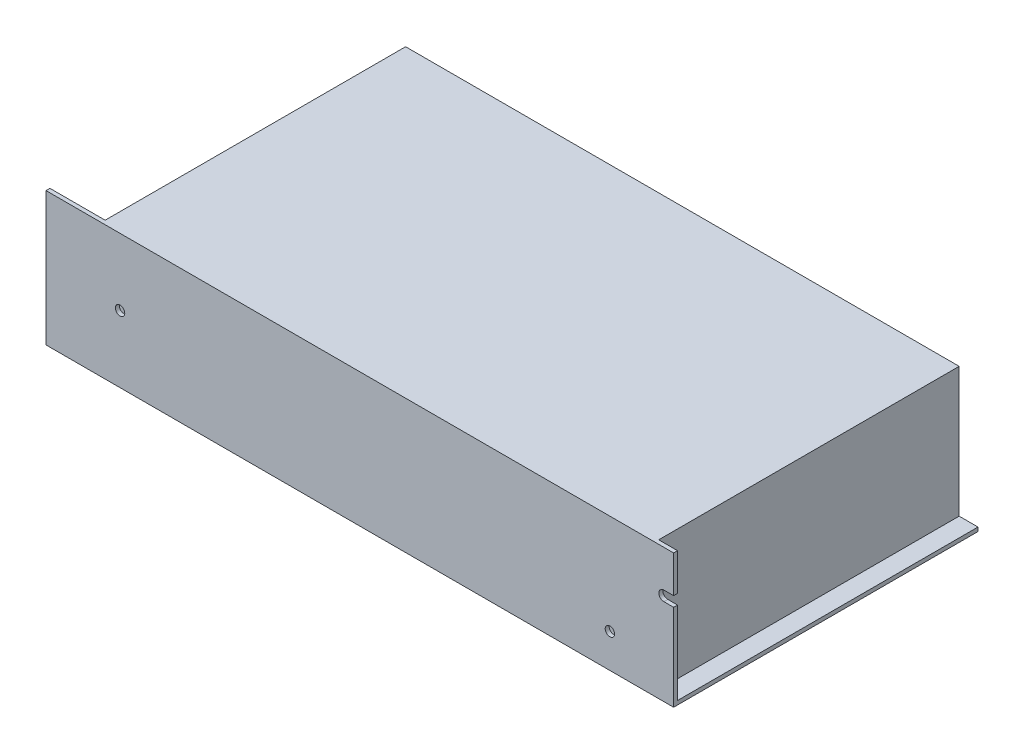
ISO-10303-21;
HEADER;
FILE_DESCRIPTION(('STEP AP214'),'2;1');
FILE_NAME('part.step','',(''),(''),'','','');
FILE_SCHEMA(('AUTOMOTIVE_DESIGN { 1 0 10303 214 1 1 1 1 }'));
ENDSEC;
DATA;
#1=APPLICATION_CONTEXT('core data for automotive mechanical design processes');
#2=APPLICATION_PROTOCOL_DEFINITION('international standard','automotive_design',2000,#1);
#3=PRODUCT_CONTEXT('',#1,'mechanical');
#4=PRODUCT('Part','Part','',(#3));
#5=PRODUCT_RELATED_PRODUCT_CATEGORY('part','',(#4));
#6=PRODUCT_DEFINITION_FORMATION('','',#4);
#7=PRODUCT_DEFINITION_CONTEXT('part definition',#1,'design');
#8=PRODUCT_DEFINITION('design','',#6,#7);
#9=PRODUCT_DEFINITION_SHAPE('','',#8);
#10=(LENGTH_UNIT() NAMED_UNIT(*) SI_UNIT(.MILLI.,.METRE.));
#11=(NAMED_UNIT(*) PLANE_ANGLE_UNIT() SI_UNIT($,.RADIAN.));
#12=(NAMED_UNIT(*) SI_UNIT($,.STERADIAN.) SOLID_ANGLE_UNIT());
#13=UNCERTAINTY_MEASURE_WITH_UNIT(LENGTH_MEASURE(1.E-05),#10,'distance_accuracy_value','');
#14=(GEOMETRIC_REPRESENTATION_CONTEXT(3) GLOBAL_UNCERTAINTY_ASSIGNED_CONTEXT((#13)) GLOBAL_UNIT_ASSIGNED_CONTEXT((#10,
#11,#12)) REPRESENTATION_CONTEXT('',''));
#15=CARTESIAN_POINT('',(0.,0.,0.));
#16=DIRECTION('',(0.,0.,1.));
#17=DIRECTION('',(1.,0.,0.));
#18=AXIS2_PLACEMENT_3D('',#15,#16,#17);
#19=CARTESIAN_POINT('',(139.453125,1.25,-54.8828125));
#20=DIRECTION('',(-1.,0.,0.));
#21=DIRECTION('',(0.,0.,1.));
#22=AXIS2_PLACEMENT_3D('',#19,#20,#21);
#23=PLANE('',#22);
#24=DIRECTION('',(0.,-1.,0.));
#25=VECTOR('',#24,1.);
#26=CARTESIAN_POINT('',(139.453125,1.25,-54.8828125));
#27=LINE('',#26,#25);
#28=CARTESIAN_POINT('',(139.453125,1.25,-54.8828125));
#29=VERTEX_POINT('',#28);
#30=CARTESIAN_POINT('',(139.453125,0.,-54.8828125));
#31=VERTEX_POINT('',#30);
#32=EDGE_CURVE('E292',#29,#31,#27,.T.);
#33=ORIENTED_EDGE('',*,*,#32,.F.);
#34=DIRECTION('',(0.,0.,-1.));
#35=VECTOR('',#34,1.);
#36=CARTESIAN_POINT('',(139.453125,1.25,40.8671875));
#37=LINE('',#36,#35);
#38=CARTESIAN_POINT('',(139.453125,1.25,40.8671875));
#39=VERTEX_POINT('',#38);
#40=EDGE_CURVE('E165',#39,#29,#37,.T.);
#41=ORIENTED_EDGE('',*,*,#40,.F.);
#42=DIRECTION('',(0.,-1.,0.));
#43=VECTOR('',#42,1.);
#44=CARTESIAN_POINT('',(139.453125,1.25,40.8671875));
#45=LINE('',#44,#43);
#46=CARTESIAN_POINT('',(139.453125,27.6,40.8671875));
#47=VERTEX_POINT('',#46);
#48=EDGE_CURVE('E331',#47,#39,#45,.T.);
#49=ORIENTED_EDGE('',*,*,#48,.F.);
#50=DIRECTION('',(0.,0.,1.));
#51=VECTOR('',#50,1.);
#52=CARTESIAN_POINT('',(139.453125,27.6,35.1812399096682));
#53=LINE('',#52,#51);
#54=CARTESIAN_POINT('',(139.453125,27.6,42.1171875));
#55=VERTEX_POINT('',#54);
#56=EDGE_CURVE('E188',#47,#55,#53,.T.);
#57=ORIENTED_EDGE('',*,*,#56,.T.);
#58=DIRECTION('',(0.,-1.,0.));
#59=VECTOR('',#58,1.);
#60=CARTESIAN_POINT('',(139.453125,1.25,42.1171875));
#61=LINE('',#60,#59);
#62=CARTESIAN_POINT('',(139.453125,0.,42.1171875));
#63=VERTEX_POINT('',#62);
#64=EDGE_CURVE('E293',#55,#63,#61,.T.);
#65=ORIENTED_EDGE('',*,*,#64,.T.);
#66=DIRECTION('',(0.,0.,-1.));
#67=VECTOR('',#66,1.);
#68=CARTESIAN_POINT('',(139.453125,0.,-54.8828125));
#69=LINE('',#68,#67);
#70=EDGE_CURVE('E286',#63,#31,#69,.T.);
#71=ORIENTED_EDGE('',*,*,#70,.T.);
#72=EDGE_LOOP('',(#33,#41,#49,#57,#65,#71));
#73=FACE_BOUND('',#72,.T.);
#74=ADVANCED_FACE('F32',(#73),#23,.F.);
#75=CARTESIAN_POINT('',(0.,1.25,0.));
#76=DIRECTION('',(0.,1.,0.));
#77=DIRECTION('',(0.,0.,1.));
#78=AXIS2_PLACEMENT_3D('',#75,#76,#77);
#79=PLANE('',#78);
#80=DIRECTION('',(0.,0.,1.));
#81=VECTOR('',#80,1.);
#82=CARTESIAN_POINT('',(-42.9514329885592,1.25,-54.8828125));
#83=LINE('',#82,#81);
#84=CARTESIAN_POINT('',(-42.9514329885592,1.25,34.015615746176));
#85=VERTEX_POINT('',#84);
#86=CARTESIAN_POINT('',(-42.9514329885592,1.25,40.8671875));
#87=VERTEX_POINT('',#86);
#88=EDGE_CURVE('E54',#85,#87,#83,.T.);
#89=ORIENTED_EDGE('',*,*,#88,.F.);
#90=DIRECTION('',(1.,0.,0.));
#91=VECTOR('',#90,1.);
#92=CARTESIAN_POINT('',(-60.546875,1.25,34.015615746176));
#93=LINE('',#92,#91);
#94=CARTESIAN_POINT('',(-60.546875,1.25,34.015615746176));
#95=VERTEX_POINT('',#94);
#96=EDGE_CURVE('E201',#95,#85,#93,.T.);
#97=ORIENTED_EDGE('',*,*,#96,.F.);
#98=DIRECTION('',(0.,0.,1.));
#99=VECTOR('',#98,1.);
#100=CARTESIAN_POINT('',(-60.546875,1.25,-54.8828125));
#101=LINE('',#100,#99);
#102=CARTESIAN_POINT('',(-60.546875,1.25,40.8671875));
#103=VERTEX_POINT('',#102);
#104=EDGE_CURVE('E278',#95,#103,#101,.T.);
#105=ORIENTED_EDGE('',*,*,#104,.T.);
#106=DIRECTION('',(-1.,0.,0.));
#107=VECTOR('',#106,1.);
#108=CARTESIAN_POINT('',(0.,1.25,40.8671875));
#109=LINE('',#108,#107);
#110=EDGE_CURVE('E274',#87,#103,#109,.T.);
#111=ORIENTED_EDGE('',*,*,#110,.F.);
#112=EDGE_LOOP('',(#89,#97,#105,#111));
#113=FACE_BOUND('',#112,.T.);
#114=ADVANCED_FACE('F347',(#113),#79,.T.);
#115=CARTESIAN_POINT('',(-42.9514329885592,248.608459231658,-54.8828125));
#116=DIRECTION('',(1.,0.,0.));
#117=DIRECTION('',(0.,0.,-1.));
#118=AXIS2_PLACEMENT_3D('',#115,#116,#117);
#119=PLANE('',#118);
#120=DIRECTION('',(0.,-1.,0.));
#121=VECTOR('',#120,1.);
#122=CARTESIAN_POINT('',(-42.9514329885592,23.25,34.015615746176));
#123=LINE('',#122,#121);
#124=CARTESIAN_POINT('',(-42.9514329885592,23.25,34.015615746176));
#125=VERTEX_POINT('',#124);
#126=EDGE_CURVE('E47',#125,#85,#123,.T.);
#127=ORIENTED_EDGE('',*,*,#126,.T.);
#128=ORIENTED_EDGE('',*,*,#88,.T.);
#129=DIRECTION('',(0.,-1.,0.));
#130=VECTOR('',#129,1.);
#131=CARTESIAN_POINT('',(-42.9514329885592,248.608459231658,40.8671875));
#132=LINE('',#131,#130);
#133=CARTESIAN_POINT('',(-42.9514329885592,42.6,40.8671875));
#134=VERTEX_POINT('',#133);
#135=EDGE_CURVE('E236',#134,#87,#132,.T.);
#136=ORIENTED_EDGE('',*,*,#135,.F.);
#137=DIRECTION('',(0.,0.,-1.));
#138=VECTOR('',#137,1.);
#139=CARTESIAN_POINT('',(-42.9514329885592,42.6,-54.8828125));
#140=LINE('',#139,#138);
#141=CARTESIAN_POINT('',(-42.9514329885592,42.6,-54.8828125));
#142=VERTEX_POINT('',#141);
#143=EDGE_CURVE('E227',#134,#142,#140,.T.);
#144=ORIENTED_EDGE('',*,*,#143,.T.);
#145=DIRECTION('',(0.,-1.,0.));
#146=VECTOR('',#145,1.);
#147=CARTESIAN_POINT('',(-42.9514329885592,248.608459231658,-54.8828125));
#148=LINE('',#147,#146);
#149=CARTESIAN_POINT('',(-42.9514329885592,23.25,-54.8828125));
#150=VERTEX_POINT('',#149);
#151=EDGE_CURVE('E233',#142,#150,#148,.T.);
#152=ORIENTED_EDGE('',*,*,#151,.T.);
#153=DIRECTION('',(0.,0.,-1.));
#154=VECTOR('',#153,1.);
#155=CARTESIAN_POINT('',(-42.9514329885592,23.25,-54.8828125));
#156=LINE('',#155,#154);
#157=EDGE_CURVE('E218',#125,#150,#156,.T.);
#158=ORIENTED_EDGE('',*,*,#157,.F.);
#159=EDGE_LOOP('',(#127,#128,#136,#144,#152,#158));
#160=FACE_BOUND('',#159,.T.);
#161=ADVANCED_FACE('F325',(#160),#119,.F.);
#162=CARTESIAN_POINT('',(-60.546875,42.6,40.8671875));
#163=DIRECTION('',(0.,0.,-1.));
#164=DIRECTION('',(-1.,0.,0.));
#165=AXIS2_PLACEMENT_3D('',#162,#163,#164);
#166=PLANE('',#165);
#167=DIRECTION('',(1.,0.,0.));
#168=VECTOR('',#167,1.);
#169=CARTESIAN_POINT('',(-60.546875,42.6,40.8671875));
#170=LINE('',#169,#168);
#171=CARTESIAN_POINT('',(-60.546875,42.6,40.8671875));
#172=VERTEX_POINT('',#171);
#173=EDGE_CURVE('E265',#172,#134,#170,.T.);
#174=ORIENTED_EDGE('',*,*,#173,.T.);
#175=ORIENTED_EDGE('',*,*,#135,.T.);
#176=ORIENTED_EDGE('',*,*,#110,.T.);
#177=DIRECTION('',(0.,-1.,0.));
#178=VECTOR('',#177,1.);
#179=CARTESIAN_POINT('',(-60.546875,42.6,40.8671875));
#180=LINE('',#179,#178);
#181=EDGE_CURVE('E271',#172,#103,#180,.T.);
#182=ORIENTED_EDGE('',*,*,#181,.F.);
#183=EDGE_LOOP('',(#174,#175,#176,#182));
#184=FACE_BOUND('',#183,.T.);
#185=ADVANCED_FACE('F410',(#184),#166,.T.);
#186=CARTESIAN_POINT('',(-60.546875,1.25,-54.8828125));
#187=DIRECTION('',(1.,0.,0.));
#188=DIRECTION('',(0.,0.,-1.));
#189=AXIS2_PLACEMENT_3D('',#186,#187,#188);
#190=PLANE('',#189);
#191=DIRECTION('',(0.,0.,1.));
#192=VECTOR('',#191,1.);
#193=CARTESIAN_POINT('',(-60.546875,0.,-54.8828125));
#194=LINE('',#193,#192);
#195=CARTESIAN_POINT('',(-60.546875,0.,-54.8828125));
#196=VERTEX_POINT('',#195);
#197=CARTESIAN_POINT('',(-60.546875,0.,42.1171875));
#198=VERTEX_POINT('',#197);
#199=EDGE_CURVE('E277',#196,#198,#194,.T.);
#200=ORIENTED_EDGE('',*,*,#199,.T.);
#201=DIRECTION('',(0.,-1.,0.));
#202=VECTOR('',#201,1.);
#203=CARTESIAN_POINT('',(-60.546875,1.25,42.1171875));
#204=LINE('',#203,#202);
#205=CARTESIAN_POINT('',(-60.546875,42.6,42.1171875));
#206=VERTEX_POINT('',#205);
#207=EDGE_CURVE('E11',#206,#198,#204,.T.);
#208=ORIENTED_EDGE('',*,*,#207,.F.);
#209=DIRECTION('',(0.,0.,-1.));
#210=VECTOR('',#209,1.);
#211=CARTESIAN_POINT('',(-60.546875,42.6,42.1171875));
#212=LINE('',#211,#210);
#213=EDGE_CURVE('E262',#206,#172,#212,.T.);
#214=ORIENTED_EDGE('',*,*,#213,.T.);
#215=ORIENTED_EDGE('',*,*,#181,.T.);
#216=ORIENTED_EDGE('',*,*,#104,.F.);
#217=DIRECTION('',(0.,-1.,0.));
#218=VECTOR('',#217,1.);
#219=CARTESIAN_POINT('',(-60.546875,23.25,34.015615746176));
#220=LINE('',#219,#218);
#221=CARTESIAN_POINT('',(-60.546875,23.25,34.015615746176));
#222=VERTEX_POINT('',#221);
#223=EDGE_CURVE('E225',#222,#95,#220,.T.);
#224=ORIENTED_EDGE('',*,*,#223,.F.);
#225=DIRECTION('',(0.,0.,1.));
#226=VECTOR('',#225,1.);
#227=CARTESIAN_POINT('',(-60.546875,23.25,-54.8828125));
#228=LINE('',#227,#226);
#229=CARTESIAN_POINT('',(-60.546875,23.25,-54.8828125));
#230=VERTEX_POINT('',#229);
#231=EDGE_CURVE('E213',#230,#222,#228,.T.);
#232=ORIENTED_EDGE('',*,*,#231,.F.);
#233=DIRECTION('',(0.,-1.,0.));
#234=VECTOR('',#233,1.);
#235=CARTESIAN_POINT('',(-60.546875,1.25,-54.8828125));
#236=LINE('',#235,#234);
#237=EDGE_CURVE('E280',#230,#196,#236,.T.);
#238=ORIENTED_EDGE('',*,*,#237,.T.);
#239=EDGE_LOOP('',(#200,#208,#214,#215,#216,#224,#232,#238));
#240=FACE_BOUND('',#239,.T.);
#241=ADVANCED_FACE('F34',(#240),#190,.F.);
#242=CARTESIAN_POINT('',(-60.546875,1.25,42.1171875));
#243=DIRECTION('',(0.,0.,-1.));
#244=DIRECTION('',(-1.,0.,0.));
#245=AXIS2_PLACEMENT_3D('',#242,#243,#244);
#246=PLANE('',#245);
#247=ORIENTED_EDGE('',*,*,#64,.F.);
#248=DIRECTION('',(1.,0.,0.));
#249=VECTOR('',#248,1.);
#250=CARTESIAN_POINT('',(139.453125,27.6,42.1171875));
#251=LINE('',#250,#249);
#252=CARTESIAN_POINT('',(136.353125,27.6,42.1171875));
#253=VERTEX_POINT('',#252);
#254=EDGE_CURVE('E181',#253,#55,#251,.T.);
#255=ORIENTED_EDGE('',*,*,#254,.F.);
#256=CARTESIAN_POINT('',(136.353125,29.2,42.1171875));
#257=DIRECTION('',(0.,0.,1.));
#258=DIRECTION('',(1.,0.,0.));
#259=AXIS2_PLACEMENT_3D('',#256,#257,#258);
#260=CIRCLE('',#259,1.6);
#261=CARTESIAN_POINT('',(136.353125,30.8,42.1171875));
#262=VERTEX_POINT('',#261);
#263=EDGE_CURVE('E183',#262,#253,#260,.T.);
#264=ORIENTED_EDGE('',*,*,#263,.F.);
#265=DIRECTION('',(-1.,0.,0.));
#266=VECTOR('',#265,1.);
#267=CARTESIAN_POINT('',(136.353125,30.8,42.1171875));
#268=LINE('',#267,#266);
#269=CARTESIAN_POINT('',(139.453125,30.8,42.1171875));
#270=VERTEX_POINT('',#269);
#271=EDGE_CURVE('E177',#270,#262,#268,.T.);
#272=ORIENTED_EDGE('',*,*,#271,.F.);
#273=CARTESIAN_POINT('',(139.453125,42.6,42.1171875));
#274=VERTEX_POINT('',#273);
#275=EDGE_CURVE('E40',#274,#270,#61,.T.);
#276=ORIENTED_EDGE('',*,*,#275,.F.);
#277=DIRECTION('',(-1.,0.,0.));
#278=VECTOR('',#277,1.);
#279=CARTESIAN_POINT('',(-60.546875,42.6,42.1171875));
#280=LINE('',#279,#278);
#281=EDGE_CURVE('E268',#274,#206,#280,.T.);
#282=ORIENTED_EDGE('',*,*,#281,.T.);
#283=ORIENTED_EDGE('',*,*,#207,.T.);
#284=DIRECTION('',(1.,0.,0.));
#285=VECTOR('',#284,1.);
#286=CARTESIAN_POINT('',(-60.546875,0.,42.1171875));
#287=LINE('',#286,#285);
#288=EDGE_CURVE('E283',#198,#63,#287,.T.);
#289=ORIENTED_EDGE('',*,*,#288,.T.);
#290=EDGE_LOOP('',(#247,#255,#264,#272,#276,#282,#283,#289));
#291=FACE_BOUND('',#290,.T.);
#292=CARTESIAN_POINT('',(119.153125,10.8,42.1171875));
#293=DIRECTION('',(0.,0.,1.));
#294=DIRECTION('',(1.,0.,0.));
#295=AXIS2_PLACEMENT_3D('',#292,#293,#294);
#296=CIRCLE('',#295,1.5);
#297=CARTESIAN_POINT('',(120.653125,10.8,42.1171875));
#298=VERTEX_POINT('',#297);
#299=EDGE_CURVE('E202',#298,#298,#296,.T.);
#300=ORIENTED_EDGE('',*,*,#299,.F.);
#301=EDGE_LOOP('',(#300));
#302=FACE_BOUND('',#301,.T.);
#303=CARTESIAN_POINT('',(-36.946875,21.3,42.1171875));
#304=DIRECTION('',(0.,0.,1.));
#305=DIRECTION('',(1.,0.,0.));
#306=AXIS2_PLACEMENT_3D('',#303,#304,#305);
#307=CIRCLE('',#306,1.5);
#308=CARTESIAN_POINT('',(-35.446875,21.3,42.1171875));
#309=VERTEX_POINT('',#308);
#310=EDGE_CURVE('E208',#309,#309,#307,.T.);
#311=ORIENTED_EDGE('',*,*,#310,.F.);
#312=EDGE_LOOP('',(#311));
#313=FACE_BOUND('',#312,.T.);
#314=ADVANCED_FACE('F308',(#291,#302,#313),#246,.F.);
#315=DIRECTION('',(0.,0.,1.));
#316=VECTOR('',#315,1.);
#317=CARTESIAN_POINT('',(139.453125,30.8,35.1812399096682));
#318=LINE('',#317,#316);
#319=CARTESIAN_POINT('',(139.453125,30.8,40.8671875));
#320=VERTEX_POINT('',#319);
#321=EDGE_CURVE('E195',#320,#270,#318,.T.);
#322=ORIENTED_EDGE('',*,*,#321,.F.);
#323=CARTESIAN_POINT('',(139.453125,42.6,40.8671875));
#324=VERTEX_POINT('',#323);
#325=EDGE_CURVE('E332',#324,#320,#45,.T.);
#326=ORIENTED_EDGE('',*,*,#325,.F.);
#327=DIRECTION('',(0.,0.,1.));
#328=VECTOR('',#327,1.);
#329=CARTESIAN_POINT('',(139.453125,42.6,42.1171875));
#330=LINE('',#329,#328);
#331=EDGE_CURVE('E170',#324,#274,#330,.T.);
#332=ORIENTED_EDGE('',*,*,#331,.T.);
#333=ORIENTED_EDGE('',*,*,#275,.T.);
#334=EDGE_LOOP('',(#322,#326,#332,#333));
#335=FACE_BOUND('',#334,.T.);
#336=ADVANCED_FACE('F349',(#335),#23,.F.);
#337=CARTESIAN_POINT('',(-60.546875,1.25,-54.8828125));
#338=DIRECTION('',(0.,0.,1.));
#339=DIRECTION('',(1.,0.,0.));
#340=AXIS2_PLACEMENT_3D('',#337,#338,#339);
#341=PLANE('',#340);
#342=DIRECTION('',(0.,1.,0.));
#343=VECTOR('',#342,1.);
#344=CARTESIAN_POINT('',(133.453125,1.25,-54.8828125));
#345=LINE('',#344,#343);
#346=CARTESIAN_POINT('',(133.453125,1.25,-54.8828125));
#347=VERTEX_POINT('',#346);
#348=CARTESIAN_POINT('',(133.453125,42.6,-54.8828125));
#349=VERTEX_POINT('',#348);
#350=EDGE_CURVE('E162',#347,#349,#345,.T.);
#351=ORIENTED_EDGE('',*,*,#350,.F.);
#352=DIRECTION('',(1.,0.,0.));
#353=VECTOR('',#352,1.);
#354=CARTESIAN_POINT('',(133.453125,1.25,-54.8828125));
#355=LINE('',#354,#353);
#356=EDGE_CURVE('E172',#347,#29,#355,.T.);
#357=ORIENTED_EDGE('',*,*,#356,.T.);
#358=ORIENTED_EDGE('',*,*,#32,.T.);
#359=DIRECTION('',(-1.,0.,0.));
#360=VECTOR('',#359,1.);
#361=CARTESIAN_POINT('',(-60.546875,0.,-54.8828125));
#362=LINE('',#361,#360);
#363=EDGE_CURVE('E281',#31,#196,#362,.T.);
#364=ORIENTED_EDGE('',*,*,#363,.T.);
#365=ORIENTED_EDGE('',*,*,#237,.F.);
#366=DIRECTION('',(-1.,0.,0.));
#367=VECTOR('',#366,1.);
#368=CARTESIAN_POINT('',(-60.546875,23.25,-54.8828125));
#369=LINE('',#368,#367);
#370=EDGE_CURVE('E220',#150,#230,#369,.T.);
#371=ORIENTED_EDGE('',*,*,#370,.F.);
#372=ORIENTED_EDGE('',*,*,#151,.F.);
#373=DIRECTION('',(1.,0.,0.));
#374=VECTOR('',#373,1.);
#375=CARTESIAN_POINT('',(-42.9514329885592,42.6,-54.8828125));
#376=LINE('',#375,#374);
#377=EDGE_CURVE('E231',#142,#349,#376,.T.);
#378=ORIENTED_EDGE('',*,*,#377,.T.);
#379=EDGE_LOOP('',(#351,#357,#358,#364,#365,#371,#372,#378));
#380=FACE_BOUND('',#379,.T.);
#381=ADVANCED_FACE('F314',(#380),#341,.F.);
#382=CARTESIAN_POINT('',(0.,0.,0.));
#383=DIRECTION('',(0.,1.,0.));
#384=DIRECTION('',(0.,0.,1.));
#385=AXIS2_PLACEMENT_3D('',#382,#383,#384);
#386=PLANE('',#385);
#387=CARTESIAN_POINT('',(121.653125,0.,25.8671875));
#388=DIRECTION('',(0.,-1.,0.));
#389=DIRECTION('',(0.,0.,-1.));
#390=AXIS2_PLACEMENT_3D('',#387,#388,#389);
#391=CIRCLE('',#390,1.49999999999998);
#392=CARTESIAN_POINT('',(121.653125,0.,24.3671875));
#393=VERTEX_POINT('',#392);
#394=EDGE_CURVE('E245',#393,#393,#391,.T.);
#395=ORIENTED_EDGE('',*,*,#394,.F.);
#396=EDGE_LOOP('',(#395));
#397=FACE_BOUND('',#396,.T.);
#398=CARTESIAN_POINT('',(17.1068892776804,0.,-38.6328125000004));
#399=DIRECTION('',(0.,-1.,0.));
#400=DIRECTION('',(0.,0.,-1.));
#401=AXIS2_PLACEMENT_3D('',#398,#399,#400);
#402=CIRCLE('',#401,1.74623572231967);
#403=CARTESIAN_POINT('',(17.1068892776804,0.,-40.3790482223201));
#404=VERTEX_POINT('',#403);
#405=EDGE_CURVE('E244',#404,#404,#402,.T.);
#406=ORIENTED_EDGE('',*,*,#405,.F.);
#407=EDGE_LOOP('',(#406));
#408=FACE_BOUND('',#407,.T.);
#409=CARTESIAN_POINT('',(17.3531250000001,0.,25.8671875));
#410=DIRECTION('',(0.,-1.,0.));
#411=DIRECTION('',(0.,0.,-1.));
#412=AXIS2_PLACEMENT_3D('',#409,#410,#411);
#413=CIRCLE('',#412,1.49999999999998);
#414=CARTESIAN_POINT('',(17.3531250000001,0.,24.3671875));
#415=VERTEX_POINT('',#414);
#416=EDGE_CURVE('E230',#415,#415,#413,.T.);
#417=ORIENTED_EDGE('',*,*,#416,.F.);
#418=EDGE_LOOP('',(#417));
#419=FACE_BOUND('',#418,.T.);
#420=CARTESIAN_POINT('',(121.653125,0.,-38.6328125));
#421=DIRECTION('',(0.,-1.,0.));
#422=DIRECTION('',(0.,0.,-1.));
#423=AXIS2_PLACEMENT_3D('',#420,#421,#422);
#424=CIRCLE('',#423,1.5);
#425=CARTESIAN_POINT('',(121.653125,0.,-40.1328125));
#426=VERTEX_POINT('',#425);
#427=EDGE_CURVE('E252',#426,#426,#424,.T.);
#428=ORIENTED_EDGE('',*,*,#427,.F.);
#429=EDGE_LOOP('',(#428));
#430=FACE_BOUND('',#429,.T.);
#431=ORIENTED_EDGE('',*,*,#363,.F.);
#432=ORIENTED_EDGE('',*,*,#70,.F.);
#433=ORIENTED_EDGE('',*,*,#288,.F.);
#434=ORIENTED_EDGE('',*,*,#199,.F.);
#435=EDGE_LOOP('',(#431,#432,#433,#434));
#436=FACE_BOUND('',#435,.T.);
#437=ADVANCED_FACE('F312',(#397,#408,#419,#430,#436),#386,.F.);
#438=CARTESIAN_POINT('',(0.,42.6,0.));
#439=DIRECTION('',(0.,-1.,0.));
#440=DIRECTION('',(0.,0.,-1.));
#441=AXIS2_PLACEMENT_3D('',#438,#439,#440);
#442=PLANE('',#441);
#443=ORIENTED_EDGE('',*,*,#331,.F.);
#444=DIRECTION('',(1.,0.,0.));
#445=VECTOR('',#444,1.);
#446=CARTESIAN_POINT('',(133.453125,42.6,40.8671875));
#447=LINE('',#446,#445);
#448=CARTESIAN_POINT('',(133.453125,42.6,40.8671875));
#449=VERTEX_POINT('',#448);
#450=EDGE_CURVE('E149',#449,#324,#447,.T.);
#451=ORIENTED_EDGE('',*,*,#450,.F.);
#452=DIRECTION('',(0.,0.,1.));
#453=VECTOR('',#452,1.);
#454=CARTESIAN_POINT('',(133.453125,42.6,40.8671875));
#455=LINE('',#454,#453);
#456=EDGE_CURVE('E157',#349,#449,#455,.T.);
#457=ORIENTED_EDGE('',*,*,#456,.F.);
#458=ORIENTED_EDGE('',*,*,#377,.F.);
#459=ORIENTED_EDGE('',*,*,#143,.F.);
#460=ORIENTED_EDGE('',*,*,#173,.F.);
#461=ORIENTED_EDGE('',*,*,#213,.F.);
#462=ORIENTED_EDGE('',*,*,#281,.F.);
#463=EDGE_LOOP('',(#443,#451,#457,#458,#459,#460,#461,#462));
#464=FACE_BOUND('',#463,.T.);
#465=ADVANCED_FACE('F168',(#464),#442,.F.);
#466=CARTESIAN_POINT('',(121.653125,6.18910048320972,-38.6328125));
#467=DIRECTION('',(0.,-1.,0.));
#468=DIRECTION('',(0.,0.,-1.));
#469=AXIS2_PLACEMENT_3D('',#466,#467,#468);
#470=CYLINDRICAL_SURFACE('',#469,1.5);
#471=ORIENTED_EDGE('',*,*,#427,.T.);
#472=EDGE_LOOP('',(#471));
#473=FACE_BOUND('',#472,.T.);
#474=CARTESIAN_POINT('',(121.653125,1.25,-38.6328125));
#475=DIRECTION('',(0.,1.,0.));
#476=DIRECTION('',(0.,0.,1.));
#477=AXIS2_PLACEMENT_3D('',#474,#475,#476);
#478=CIRCLE('',#477,1.5);
#479=CARTESIAN_POINT('',(121.653125,1.25,-37.1328125));
#480=VERTEX_POINT('',#479);
#481=EDGE_CURVE('E259',#480,#480,#478,.F.);
#482=ORIENTED_EDGE('',*,*,#481,.F.);
#483=EDGE_LOOP('',(#482));
#484=FACE_BOUND('',#483,.T.);
#485=ADVANCED_FACE('F415',(#473,#484),#470,.F.);
#486=CARTESIAN_POINT('',(17.3531250000001,6.18910048320972,25.8671875));
#487=DIRECTION('',(0.,-1.,0.));
#488=DIRECTION('',(0.,0.,-1.));
#489=AXIS2_PLACEMENT_3D('',#486,#487,#488);
#490=CYLINDRICAL_SURFACE('',#489,1.49999999999998);
#491=ORIENTED_EDGE('',*,*,#416,.T.);
#492=EDGE_LOOP('',(#491));
#493=FACE_BOUND('',#492,.T.);
#494=CARTESIAN_POINT('',(17.3531250000001,1.25,25.8671875));
#495=DIRECTION('',(0.,1.,0.));
#496=DIRECTION('',(0.,0.,1.));
#497=AXIS2_PLACEMENT_3D('',#494,#495,#496);
#498=CIRCLE('',#497,1.49999999999998);
#499=CARTESIAN_POINT('',(17.3531250000001,1.25,27.3671875));
#500=VERTEX_POINT('',#499);
#501=EDGE_CURVE('E241',#500,#500,#498,.F.);
#502=ORIENTED_EDGE('',*,*,#501,.F.);
#503=EDGE_LOOP('',(#502));
#504=FACE_BOUND('',#503,.T.);
#505=ADVANCED_FACE('F411',(#493,#504),#490,.F.);
#506=CARTESIAN_POINT('',(17.1068892776804,6.18910048320972,-38.6328125000004));
#507=DIRECTION('',(0.,-1.,0.));
#508=DIRECTION('',(0.,0.,-1.));
#509=AXIS2_PLACEMENT_3D('',#506,#507,#508);
#510=CYLINDRICAL_SURFACE('',#509,1.74623572231967);
#511=ORIENTED_EDGE('',*,*,#405,.T.);
#512=EDGE_LOOP('',(#511));
#513=FACE_BOUND('',#512,.T.);
#514=CARTESIAN_POINT('',(17.1068892776804,1.25,-38.6328125000004));
#515=DIRECTION('',(0.,1.,0.));
#516=DIRECTION('',(0.,0.,1.));
#517=AXIS2_PLACEMENT_3D('',#514,#515,#516);
#518=CIRCLE('',#517,1.74623572231967);
#519=CARTESIAN_POINT('',(17.1068892776804,1.25,-36.8865767776807));
#520=VERTEX_POINT('',#519);
#521=EDGE_CURVE('E249',#520,#520,#518,.F.);
#522=ORIENTED_EDGE('',*,*,#521,.F.);
#523=EDGE_LOOP('',(#522));
#524=FACE_BOUND('',#523,.T.);
#525=ADVANCED_FACE('F414',(#513,#524),#510,.F.);
#526=CARTESIAN_POINT('',(121.653125,6.18910048320972,25.8671875));
#527=DIRECTION('',(0.,-1.,0.));
#528=DIRECTION('',(0.,0.,-1.));
#529=AXIS2_PLACEMENT_3D('',#526,#527,#528);
#530=CYLINDRICAL_SURFACE('',#529,1.49999999999998);
#531=ORIENTED_EDGE('',*,*,#394,.T.);
#532=EDGE_LOOP('',(#531));
#533=FACE_BOUND('',#532,.T.);
#534=CARTESIAN_POINT('',(121.653125,1.25,25.8671875));
#535=DIRECTION('',(0.,1.,0.));
#536=DIRECTION('',(0.,0.,1.));
#537=AXIS2_PLACEMENT_3D('',#534,#535,#536);
#538=CIRCLE('',#537,1.49999999999998);
#539=CARTESIAN_POINT('',(121.653125,1.25,27.3671875));
#540=VERTEX_POINT('',#539);
#541=EDGE_CURVE('E248',#540,#540,#538,.F.);
#542=ORIENTED_EDGE('',*,*,#541,.F.);
#543=EDGE_LOOP('',(#542));
#544=FACE_BOUND('',#543,.T.);
#545=ADVANCED_FACE('F417',(#533,#544),#530,.F.);
#546=CARTESIAN_POINT('',(0.,1.25,0.));
#547=DIRECTION('',(0.,1.,0.));
#548=DIRECTION('',(0.,0.,1.));
#549=AXIS2_PLACEMENT_3D('',#546,#547,#548);
#550=PLANE('',#549);
#551=ORIENTED_EDGE('',*,*,#541,.T.);
#552=EDGE_LOOP('',(#551));
#553=FACE_BOUND('',#552,.T.);
#554=ADVANCED_FACE('F407',(#553),#550,.F.);
#555=ORIENTED_EDGE('',*,*,#521,.T.);
#556=EDGE_LOOP('',(#555));
#557=FACE_BOUND('',#556,.T.);
#558=ADVANCED_FACE('F449',(#557),#550,.F.);
#559=ORIENTED_EDGE('',*,*,#501,.T.);
#560=EDGE_LOOP('',(#559));
#561=FACE_BOUND('',#560,.T.);
#562=ADVANCED_FACE('F405',(#561),#550,.F.);
#563=ORIENTED_EDGE('',*,*,#481,.T.);
#564=EDGE_LOOP('',(#563));
#565=FACE_BOUND('',#564,.T.);
#566=ADVANCED_FACE('F402',(#565),#550,.F.);
#567=CARTESIAN_POINT('',(-60.546875,23.25,34.015615746176));
#568=DIRECTION('',(0.,0.,-1.));
#569=DIRECTION('',(-1.,0.,0.));
#570=AXIS2_PLACEMENT_3D('',#567,#568,#569);
#571=PLANE('',#570);
#572=ORIENTED_EDGE('',*,*,#96,.T.);
#573=ORIENTED_EDGE('',*,*,#126,.F.);
#574=DIRECTION('',(1.,0.,0.));
#575=VECTOR('',#574,1.);
#576=CARTESIAN_POINT('',(-60.546875,23.25,34.015615746176));
#577=LINE('',#576,#575);
#578=EDGE_CURVE('E216',#222,#125,#577,.T.);
#579=ORIENTED_EDGE('',*,*,#578,.F.);
#580=ORIENTED_EDGE('',*,*,#223,.T.);
#581=EDGE_LOOP('',(#572,#573,#579,#580));
#582=FACE_BOUND('',#581,.T.);
#583=ADVANCED_FACE('F381',(#582),#571,.F.);
#584=CARTESIAN_POINT('',(0.,23.25,0.));
#585=DIRECTION('',(0.,1.,0.));
#586=DIRECTION('',(0.,0.,1.));
#587=AXIS2_PLACEMENT_3D('',#584,#585,#586);
#588=PLANE('',#587);
#589=ORIENTED_EDGE('',*,*,#231,.T.);
#590=ORIENTED_EDGE('',*,*,#578,.T.);
#591=ORIENTED_EDGE('',*,*,#157,.T.);
#592=ORIENTED_EDGE('',*,*,#370,.T.);
#593=EDGE_LOOP('',(#589,#590,#591,#592));
#594=FACE_BOUND('',#593,.T.);
#595=ADVANCED_FACE('F322',(#594),#588,.T.);
#596=CARTESIAN_POINT('',(139.453125,27.6,35.1812399096682));
#597=DIRECTION('',(0.,-1.,0.));
#598=DIRECTION('',(0.,0.,-1.));
#599=AXIS2_PLACEMENT_3D('',#596,#597,#598);
#600=PLANE('',#599);
#601=DIRECTION('',(0.,0.,1.));
#602=VECTOR('',#601,1.);
#603=CARTESIAN_POINT('',(136.353125,27.6,35.1812399096682));
#604=LINE('',#603,#602);
#605=CARTESIAN_POINT('',(136.353125,27.6,40.8671875));
#606=VERTEX_POINT('',#605);
#607=EDGE_CURVE('E191',#606,#253,#604,.T.);
#608=ORIENTED_EDGE('',*,*,#607,.T.);
#609=ORIENTED_EDGE('',*,*,#254,.T.);
#610=ORIENTED_EDGE('',*,*,#56,.F.);
#611=DIRECTION('',(1.,0.,0.));
#612=VECTOR('',#611,1.);
#613=CARTESIAN_POINT('',(139.453125,27.6,40.8671875));
#614=LINE('',#613,#612);
#615=EDGE_CURVE('E180',#606,#47,#614,.T.);
#616=ORIENTED_EDGE('',*,*,#615,.F.);
#617=EDGE_LOOP('',(#608,#609,#610,#616));
#618=FACE_BOUND('',#617,.T.);
#619=ADVANCED_FACE('F373',(#618),#600,.F.);
#620=CARTESIAN_POINT('',(136.353125,30.8,35.1812399096682));
#621=DIRECTION('',(0.,1.,0.));
#622=DIRECTION('',(0.,0.,1.));
#623=AXIS2_PLACEMENT_3D('',#620,#621,#622);
#624=PLANE('',#623);
#625=ORIENTED_EDGE('',*,*,#321,.T.);
#626=ORIENTED_EDGE('',*,*,#271,.T.);
#627=DIRECTION('',(0.,0.,1.));
#628=VECTOR('',#627,1.);
#629=CARTESIAN_POINT('',(136.353125,30.8,35.1812399096682));
#630=LINE('',#629,#628);
#631=CARTESIAN_POINT('',(136.353125,30.8,40.8671875));
#632=VERTEX_POINT('',#631);
#633=EDGE_CURVE('E192',#632,#262,#630,.T.);
#634=ORIENTED_EDGE('',*,*,#633,.F.);
#635=DIRECTION('',(-1.,0.,0.));
#636=VECTOR('',#635,1.);
#637=CARTESIAN_POINT('',(136.353125,30.8,40.8671875));
#638=LINE('',#637,#636);
#639=EDGE_CURVE('E193',#320,#632,#638,.T.);
#640=ORIENTED_EDGE('',*,*,#639,.F.);
#641=EDGE_LOOP('',(#625,#626,#634,#640));
#642=FACE_BOUND('',#641,.T.);
#643=ADVANCED_FACE('F364',(#642),#624,.F.);
#644=CARTESIAN_POINT('',(136.353125,29.2,35.1812399096682));
#645=DIRECTION('',(0.,0.,1.));
#646=DIRECTION('',(1.,0.,0.));
#647=AXIS2_PLACEMENT_3D('',#644,#645,#646);
#648=CYLINDRICAL_SURFACE('',#647,1.6);
#649=ORIENTED_EDGE('',*,*,#633,.T.);
#650=ORIENTED_EDGE('',*,*,#263,.T.);
#651=ORIENTED_EDGE('',*,*,#607,.F.);
#652=CARTESIAN_POINT('',(136.353125,29.2,40.8671875));
#653=DIRECTION('',(0.,0.,-1.));
#654=DIRECTION('',(-1.,0.,0.));
#655=AXIS2_PLACEMENT_3D('',#652,#653,#654);
#656=CIRCLE('',#655,1.6);
#657=EDGE_CURVE('E189',#632,#606,#656,.F.);
#658=ORIENTED_EDGE('',*,*,#657,.F.);
#659=EDGE_LOOP('',(#649,#650,#651,#658));
#660=FACE_BOUND('',#659,.T.);
#661=ADVANCED_FACE('F369',(#660),#648,.F.);
#662=CARTESIAN_POINT('',(-60.546875,42.6,40.8671875));
#663=DIRECTION('',(0.,0.,-1.));
#664=DIRECTION('',(-1.,0.,0.));
#665=AXIS2_PLACEMENT_3D('',#662,#663,#664);
#666=PLANE('',#665);
#667=CARTESIAN_POINT('',(-36.946875,21.3,40.8671875));
#668=DIRECTION('',(0.,0.,-1.));
#669=DIRECTION('',(-1.,0.,0.));
#670=AXIS2_PLACEMENT_3D('',#667,#668,#669);
#671=CIRCLE('',#670,1.5);
#672=CARTESIAN_POINT('',(-35.446875,21.3,40.8671875));
#673=VERTEX_POINT('',#672);
#674=EDGE_CURVE('E205',#673,#673,#671,.F.);
#675=ORIENTED_EDGE('',*,*,#674,.T.);
#676=EDGE_LOOP('',(#675));
#677=FACE_BOUND('',#676,.T.);
#678=ADVANCED_FACE('F395',(#677),#666,.F.);
#679=CARTESIAN_POINT('',(-36.946875,21.3,35.1812399096682));
#680=DIRECTION('',(0.,0.,1.));
#681=DIRECTION('',(1.,0.,0.));
#682=AXIS2_PLACEMENT_3D('',#679,#680,#681);
#683=CYLINDRICAL_SURFACE('',#682,1.5);
#684=CARTESIAN_POINT('',(-35.446875,21.3,42.1171875));
#685=CARTESIAN_POINT('',(-35.446875,21.3,42.1041666666667));
#686=CARTESIAN_POINT('',(-35.446875,21.3,42.0911458333333));
#687=CARTESIAN_POINT('',(-35.446875,21.3,42.0651041666667));
#688=CARTESIAN_POINT('',(-35.446875,21.3,42.0520833333333));
#689=CARTESIAN_POINT('',(-35.446875,21.3,42.0260416666667));
#690=CARTESIAN_POINT('',(-35.446875,21.3,42.0130208333333));
#691=CARTESIAN_POINT('',(-35.446875,21.3,41.9869791666667));
#692=CARTESIAN_POINT('',(-35.446875,21.3,41.9739583333333));
#693=CARTESIAN_POINT('',(-35.446875,21.3,41.9479166666667));
#694=CARTESIAN_POINT('',(-35.446875,21.3,41.9348958333333));
#695=CARTESIAN_POINT('',(-35.446875,21.3,41.9088541666667));
#696=CARTESIAN_POINT('',(-35.446875,21.3,41.8958333333333));
#697=CARTESIAN_POINT('',(-35.446875,21.3,41.8697916666667));
#698=CARTESIAN_POINT('',(-35.446875,21.3,41.8567708333333));
#699=CARTESIAN_POINT('',(-35.446875,21.3,41.8307291666667));
#700=CARTESIAN_POINT('',(-35.446875,21.3,41.8177083333333));
#701=CARTESIAN_POINT('',(-35.446875,21.3,41.7916666666667));
#702=CARTESIAN_POINT('',(-35.446875,21.3,41.7786458333333));
#703=CARTESIAN_POINT('',(-35.446875,21.3,41.7526041666667));
#704=CARTESIAN_POINT('',(-35.446875,21.3,41.7395833333333));
#705=CARTESIAN_POINT('',(-35.446875,21.3,41.7135416666667));
#706=CARTESIAN_POINT('',(-35.446875,21.3,41.7005208333333));
#707=CARTESIAN_POINT('',(-35.446875,21.3,41.6744791666667));
#708=CARTESIAN_POINT('',(-35.446875,21.3,41.6614583333333));
#709=CARTESIAN_POINT('',(-35.446875,21.3,41.6354166666667));
#710=CARTESIAN_POINT('',(-35.446875,21.3,41.6223958333333));
#711=CARTESIAN_POINT('',(-35.446875,21.3,41.5963541666667));
#712=CARTESIAN_POINT('',(-35.446875,21.3,41.5833333333333));
#713=CARTESIAN_POINT('',(-35.446875,21.3,41.5572916666667));
#714=CARTESIAN_POINT('',(-35.446875,21.3,41.5442708333333));
#715=CARTESIAN_POINT('',(-35.446875,21.3,41.5182291666667));
#716=CARTESIAN_POINT('',(-35.446875,21.3,41.5052083333333));
#717=CARTESIAN_POINT('',(-35.446875,21.3,41.4791666666667));
#718=CARTESIAN_POINT('',(-35.446875,21.3,41.4661458333333));
#719=CARTESIAN_POINT('',(-35.446875,21.3,41.4401041666667));
#720=CARTESIAN_POINT('',(-35.446875,21.3,41.4270833333333));
#721=CARTESIAN_POINT('',(-35.446875,21.3,41.4010416666667));
#722=CARTESIAN_POINT('',(-35.446875,21.3,41.3880208333333));
#723=CARTESIAN_POINT('',(-35.446875,21.3,41.3619791666667));
#724=CARTESIAN_POINT('',(-35.446875,21.3,41.3489583333333));
#725=CARTESIAN_POINT('',(-35.446875,21.3,41.3229166666667));
#726=CARTESIAN_POINT('',(-35.446875,21.3,41.3098958333333));
#727=CARTESIAN_POINT('',(-35.446875,21.3,41.2838541666667));
#728=CARTESIAN_POINT('',(-35.446875,21.3,41.2708333333333));
#729=CARTESIAN_POINT('',(-35.446875,21.3,41.2447916666667));
#730=CARTESIAN_POINT('',(-35.446875,21.3,41.2317708333333));
#731=CARTESIAN_POINT('',(-35.446875,21.3,41.2057291666667));
#732=CARTESIAN_POINT('',(-35.446875,21.3,41.1927083333333));
#733=CARTESIAN_POINT('',(-35.446875,21.3,41.1666666666667));
#734=CARTESIAN_POINT('',(-35.446875,21.3,41.1536458333333));
#735=CARTESIAN_POINT('',(-35.446875,21.3,41.1276041666667));
#736=CARTESIAN_POINT('',(-35.446875,21.3,41.1145833333333));
#737=CARTESIAN_POINT('',(-35.446875,21.3,41.0885416666667));
#738=CARTESIAN_POINT('',(-35.446875,21.3,41.0755208333333));
#739=CARTESIAN_POINT('',(-35.446875,21.3,41.0494791666667));
#740=CARTESIAN_POINT('',(-35.446875,21.3,41.0364583333333));
#741=CARTESIAN_POINT('',(-35.446875,21.3,41.0104166666667));
#742=CARTESIAN_POINT('',(-35.446875,21.3,40.9973958333333));
#743=CARTESIAN_POINT('',(-35.446875,21.3,40.9713541666667));
#744=CARTESIAN_POINT('',(-35.446875,21.3,40.9583333333333));
#745=CARTESIAN_POINT('',(-35.446875,21.3,40.9322916666667));
#746=CARTESIAN_POINT('',(-35.446875,21.3,40.9192708333333));
#747=CARTESIAN_POINT('',(-35.446875,21.3,40.8932291666667));
#748=CARTESIAN_POINT('',(-35.446875,21.3,40.8802083333333));
#749=CARTESIAN_POINT('',(-35.446875,21.3,40.8671875));
#750=B_SPLINE_CURVE_WITH_KNOTS('',3,(#684,#685,#686,#687,#688,#689,#690,#691,#692,#693,#694,
#695,#696,#697,#698,#699,#700,#701,#702,#703,#704,#705,#706,#707,#708,#709,#710,#711,#712,#713,
#714,#715,#716,#717,#718,#719,#720,#721,#722,#723,#724,#725,#726,#727,#728,#729,#730,#731,#732,
#733,#734,#735,#736,#737,#738,#739,#740,#741,#742,#743,#744,#745,#746,#747,#748,#749),
.UNSPECIFIED.,.F.,.F.,(4,2,2,2,2,2,2,2,2,2,2,2,2,2,2,2,2,2,2,2,2,2,2,2,2,2,2,2,2,2,2,2,4),(0.,
0.0390624999999992,0.0781249999999983,0.117187499999998,0.156249999999997,0.195312499999996,
0.234374999999995,0.273437499999994,0.312499999999993,0.351562499999993,0.390624999999999,
0.429687499999998,0.468749999999997,0.507812499999996,0.546874999999995,0.585937499999994,
0.624999999999994,0.664062499999993,0.703124999999992,0.742187499999991,0.78124999999999,
0.820312499999989,0.859374999999989,0.898437499999995,0.937499999999994,0.976562499999993,
1.01562499999999,1.05468749999999,1.09374999999999,1.13281249999999,1.17187499999999,
1.21093749999999,1.24999999999999),.UNSPECIFIED.);
#751=EDGE_CURVE('BSEAM391',#309,#673,#750,.T.);
#752=ORIENTED_EDGE('',*,*,#310,.T.);
#753=ORIENTED_EDGE('',*,*,#674,.F.);
#754=ORIENTED_EDGE('',*,*,#751,.T.);
#755=ORIENTED_EDGE('',*,*,#751,.F.);
#756=EDGE_LOOP('',(#752,#754,#753,#755));
#757=FACE_BOUND('',#756,.T.);
#758=ADVANCED_FACE('F391',(#757),#683,.F.);
#759=CARTESIAN_POINT('',(-60.546875,42.6,40.8671875));
#760=DIRECTION('',(0.,0.,-1.));
#761=DIRECTION('',(-1.,0.,0.));
#762=AXIS2_PLACEMENT_3D('',#759,#760,#761);
#763=PLANE('',#762);
#764=CARTESIAN_POINT('',(119.153125,10.8,40.8671875));
#765=DIRECTION('',(0.,0.,-1.));
#766=DIRECTION('',(-1.,0.,0.));
#767=AXIS2_PLACEMENT_3D('',#764,#765,#766);
#768=CIRCLE('',#767,1.5);
#769=CARTESIAN_POINT('',(120.653125,10.8,40.8671875));
#770=VERTEX_POINT('',#769);
#771=EDGE_CURVE('E186',#770,#770,#768,.F.);
#772=ORIENTED_EDGE('',*,*,#771,.T.);
#773=EDGE_LOOP('',(#772));
#774=FACE_BOUND('',#773,.T.);
#775=ADVANCED_FACE('F387',(#774),#763,.F.);
#776=CARTESIAN_POINT('',(119.153125,10.8,35.1812399096682));
#777=DIRECTION('',(0.,0.,1.));
#778=DIRECTION('',(1.,0.,0.));
#779=AXIS2_PLACEMENT_3D('',#776,#777,#778);
#780=CYLINDRICAL_SURFACE('',#779,1.5);
#781=CARTESIAN_POINT('',(120.653125,10.8,42.1171875));
#782=CARTESIAN_POINT('',(120.653125,10.8,42.1041666666667));
#783=CARTESIAN_POINT('',(120.653125,10.8,42.0911458333333));
#784=CARTESIAN_POINT('',(120.653125,10.8,42.0651041666667));
#785=CARTESIAN_POINT('',(120.653125,10.8,42.0520833333333));
#786=CARTESIAN_POINT('',(120.653125,10.8,42.0260416666667));
#787=CARTESIAN_POINT('',(120.653125,10.8,42.0130208333333));
#788=CARTESIAN_POINT('',(120.653125,10.8,41.9869791666667));
#789=CARTESIAN_POINT('',(120.653125,10.8,41.9739583333333));
#790=CARTESIAN_POINT('',(120.653125,10.8,41.9479166666667));
#791=CARTESIAN_POINT('',(120.653125,10.8,41.9348958333333));
#792=CARTESIAN_POINT('',(120.653125,10.8,41.9088541666667));
#793=CARTESIAN_POINT('',(120.653125,10.8,41.8958333333333));
#794=CARTESIAN_POINT('',(120.653125,10.8,41.8697916666667));
#795=CARTESIAN_POINT('',(120.653125,10.8,41.8567708333333));
#796=CARTESIAN_POINT('',(120.653125,10.8,41.8307291666667));
#797=CARTESIAN_POINT('',(120.653125,10.8,41.8177083333333));
#798=CARTESIAN_POINT('',(120.653125,10.8,41.7916666666667));
#799=CARTESIAN_POINT('',(120.653125,10.8,41.7786458333333));
#800=CARTESIAN_POINT('',(120.653125,10.8,41.7526041666667));
#801=CARTESIAN_POINT('',(120.653125,10.8,41.7395833333333));
#802=CARTESIAN_POINT('',(120.653125,10.8,41.7135416666667));
#803=CARTESIAN_POINT('',(120.653125,10.8,41.7005208333333));
#804=CARTESIAN_POINT('',(120.653125,10.8,41.6744791666667));
#805=CARTESIAN_POINT('',(120.653125,10.8,41.6614583333333));
#806=CARTESIAN_POINT('',(120.653125,10.8,41.6354166666667));
#807=CARTESIAN_POINT('',(120.653125,10.8,41.6223958333333));
#808=CARTESIAN_POINT('',(120.653125,10.8,41.5963541666667));
#809=CARTESIAN_POINT('',(120.653125,10.8,41.5833333333333));
#810=CARTESIAN_POINT('',(120.653125,10.8,41.5572916666667));
#811=CARTESIAN_POINT('',(120.653125,10.8,41.5442708333333));
#812=CARTESIAN_POINT('',(120.653125,10.8,41.5182291666667));
#813=CARTESIAN_POINT('',(120.653125,10.8,41.5052083333333));
#814=CARTESIAN_POINT('',(120.653125,10.8,41.4791666666667));
#815=CARTESIAN_POINT('',(120.653125,10.8,41.4661458333333));
#816=CARTESIAN_POINT('',(120.653125,10.8,41.4401041666667));
#817=CARTESIAN_POINT('',(120.653125,10.8,41.4270833333333));
#818=CARTESIAN_POINT('',(120.653125,10.8,41.4010416666667));
#819=CARTESIAN_POINT('',(120.653125,10.8,41.3880208333333));
#820=CARTESIAN_POINT('',(120.653125,10.8,41.3619791666667));
#821=CARTESIAN_POINT('',(120.653125,10.8,41.3489583333333));
#822=CARTESIAN_POINT('',(120.653125,10.8,41.3229166666667));
#823=CARTESIAN_POINT('',(120.653125,10.8,41.3098958333333));
#824=CARTESIAN_POINT('',(120.653125,10.8,41.2838541666667));
#825=CARTESIAN_POINT('',(120.653125,10.8,41.2708333333333));
#826=CARTESIAN_POINT('',(120.653125,10.8,41.2447916666667));
#827=CARTESIAN_POINT('',(120.653125,10.8,41.2317708333333));
#828=CARTESIAN_POINT('',(120.653125,10.8,41.2057291666667));
#829=CARTESIAN_POINT('',(120.653125,10.8,41.1927083333333));
#830=CARTESIAN_POINT('',(120.653125,10.8,41.1666666666667));
#831=CARTESIAN_POINT('',(120.653125,10.8,41.1536458333333));
#832=CARTESIAN_POINT('',(120.653125,10.8,41.1276041666667));
#833=CARTESIAN_POINT('',(120.653125,10.8,41.1145833333333));
#834=CARTESIAN_POINT('',(120.653125,10.8,41.0885416666667));
#835=CARTESIAN_POINT('',(120.653125,10.8,41.0755208333333));
#836=CARTESIAN_POINT('',(120.653125,10.8,41.0494791666667));
#837=CARTESIAN_POINT('',(120.653125,10.8,41.0364583333333));
#838=CARTESIAN_POINT('',(120.653125,10.8,41.0104166666667));
#839=CARTESIAN_POINT('',(120.653125,10.8,40.9973958333333));
#840=CARTESIAN_POINT('',(120.653125,10.8,40.9713541666667));
#841=CARTESIAN_POINT('',(120.653125,10.8,40.9583333333333));
#842=CARTESIAN_POINT('',(120.653125,10.8,40.9322916666667));
#843=CARTESIAN_POINT('',(120.653125,10.8,40.9192708333333));
#844=CARTESIAN_POINT('',(120.653125,10.8,40.8932291666667));
#845=CARTESIAN_POINT('',(120.653125,10.8,40.8802083333333));
#846=CARTESIAN_POINT('',(120.653125,10.8,40.8671875));
#847=B_SPLINE_CURVE_WITH_KNOTS('',3,(#781,#782,#783,#784,#785,#786,#787,#788,#789,#790,#791,
#792,#793,#794,#795,#796,#797,#798,#799,#800,#801,#802,#803,#804,#805,#806,#807,#808,#809,#810,
#811,#812,#813,#814,#815,#816,#817,#818,#819,#820,#821,#822,#823,#824,#825,#826,#827,#828,#829,
#830,#831,#832,#833,#834,#835,#836,#837,#838,#839,#840,#841,#842,#843,#844,#845,#846),
.UNSPECIFIED.,.F.,.F.,(4,2,2,2,2,2,2,2,2,2,2,2,2,2,2,2,2,2,2,2,2,2,2,2,2,2,2,2,2,2,2,2,4),(0.,
0.0390624999999992,0.0781249999999983,0.117187499999998,0.156249999999997,0.195312499999996,
0.234374999999995,0.273437499999994,0.312499999999993,0.351562499999993,0.390624999999999,
0.429687499999998,0.468749999999997,0.507812499999996,0.546874999999995,0.585937499999994,
0.624999999999994,0.664062499999993,0.703124999999992,0.742187499999991,0.78124999999999,
0.820312499999989,0.859374999999989,0.898437499999995,0.937499999999994,0.976562499999993,
1.01562499999999,1.05468749999999,1.09374999999999,1.13281249999999,1.17187499999999,
1.21093749999999,1.24999999999999),.UNSPECIFIED.);
#848=EDGE_CURVE('BSEAM344',#298,#770,#847,.T.);
#849=ORIENTED_EDGE('',*,*,#299,.T.);
#850=ORIENTED_EDGE('',*,*,#771,.F.);
#851=ORIENTED_EDGE('',*,*,#848,.T.);
#852=ORIENTED_EDGE('',*,*,#848,.F.);
#853=EDGE_LOOP('',(#849,#851,#850,#852));
#854=FACE_BOUND('',#853,.T.);
#855=ADVANCED_FACE('F344',(#854),#780,.F.);
#856=CARTESIAN_POINT('',(133.453125,1.25,40.8671875));
#857=DIRECTION('',(0.,0.,1.));
#858=DIRECTION('',(1.,0.,0.));
#859=AXIS2_PLACEMENT_3D('',#856,#857,#858);
#860=PLANE('',#859);
#861=ORIENTED_EDGE('',*,*,#48,.T.);
#862=DIRECTION('',(1.,0.,0.));
#863=VECTOR('',#862,1.);
#864=CARTESIAN_POINT('',(133.453125,1.25,40.8671875));
#865=LINE('',#864,#863);
#866=CARTESIAN_POINT('',(133.453125,1.25,40.8671875));
#867=VERTEX_POINT('',#866);
#868=EDGE_CURVE('E152',#867,#39,#865,.T.);
#869=ORIENTED_EDGE('',*,*,#868,.F.);
#870=DIRECTION('',(0.,-1.,0.));
#871=VECTOR('',#870,1.);
#872=CARTESIAN_POINT('',(133.453125,1.25,40.8671875));
#873=LINE('',#872,#871);
#874=EDGE_CURVE('E145',#449,#867,#873,.T.);
#875=ORIENTED_EDGE('',*,*,#874,.F.);
#876=ORIENTED_EDGE('',*,*,#450,.T.);
#877=ORIENTED_EDGE('',*,*,#325,.T.);
#878=ORIENTED_EDGE('',*,*,#639,.T.);
#879=ORIENTED_EDGE('',*,*,#657,.T.);
#880=ORIENTED_EDGE('',*,*,#615,.T.);
#881=EDGE_LOOP('',(#861,#869,#875,#876,#877,#878,#879,#880));
#882=FACE_BOUND('',#881,.T.);
#883=ADVANCED_FACE('F147',(#882),#860,.F.);
#884=CARTESIAN_POINT('',(133.453125,1.25,40.8671875));
#885=DIRECTION('',(0.,-1.,0.));
#886=DIRECTION('',(0.,0.,-1.));
#887=AXIS2_PLACEMENT_3D('',#884,#885,#886);
#888=PLANE('',#887);
#889=ORIENTED_EDGE('',*,*,#40,.T.);
#890=ORIENTED_EDGE('',*,*,#356,.F.);
#891=DIRECTION('',(0.,0.,-1.));
#892=VECTOR('',#891,1.);
#893=CARTESIAN_POINT('',(133.453125,1.25,40.8671875));
#894=LINE('',#893,#892);
#895=EDGE_CURVE('E156',#867,#347,#894,.T.);
#896=ORIENTED_EDGE('',*,*,#895,.F.);
#897=ORIENTED_EDGE('',*,*,#868,.T.);
#898=EDGE_LOOP('',(#889,#890,#896,#897));
#899=FACE_BOUND('',#898,.T.);
#900=ADVANCED_FACE('F336',(#899),#888,.F.);
#901=CARTESIAN_POINT('',(133.453125,0.,0.));
#902=DIRECTION('',(1.,0.,0.));
#903=DIRECTION('',(0.,0.,-1.));
#904=AXIS2_PLACEMENT_3D('',#901,#902,#903);
#905=PLANE('',#904);
#906=ORIENTED_EDGE('',*,*,#456,.T.);
#907=ORIENTED_EDGE('',*,*,#874,.T.);
#908=ORIENTED_EDGE('',*,*,#895,.T.);
#909=ORIENTED_EDGE('',*,*,#350,.T.);
#910=EDGE_LOOP('',(#906,#907,#908,#909));
#911=FACE_BOUND('',#910,.T.);
#912=ADVANCED_FACE('F160',(#911),#905,.T.);
#913=CLOSED_SHELL('',(#74,#114,#161,#185,#241,#314,#336,#381,#437,#465,#485,#505,#525,#545,#554,
#558,#562,#566,#583,#595,#619,#643,#661,#678,#758,#775,#855,#883,#900,#912));
#914=MANIFOLD_SOLID_BREP('B2',#913);
#915=ADVANCED_BREP_SHAPE_REPRESENTATION('',(#18,#914),#14);
#916=SHAPE_DEFINITION_REPRESENTATION(#9,#915);
ENDSEC;
END-ISO-10303-21;
